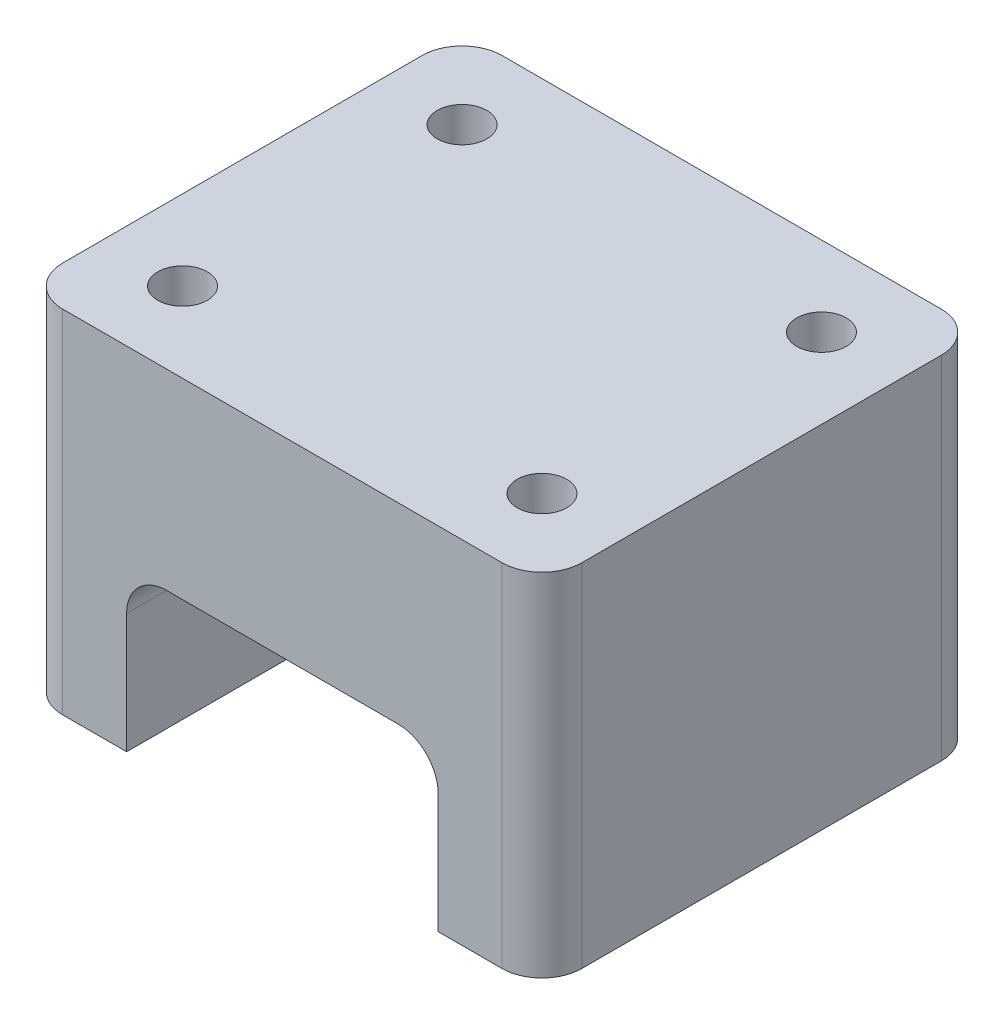
ISO-10303-21;
HEADER;
FILE_DESCRIPTION(('STEP AP214'),'2;1');
FILE_NAME('part.step','',(''),(''),'','','');
FILE_SCHEMA(('AUTOMOTIVE_DESIGN { 1 0 10303 214 1 1 1 1 }'));
ENDSEC;
DATA;
#1=APPLICATION_CONTEXT('core data for automotive mechanical design processes');
#2=APPLICATION_PROTOCOL_DEFINITION('international standard','automotive_design',2000,#1);
#3=PRODUCT_CONTEXT('',#1,'mechanical');
#4=PRODUCT('Part','Part','',(#3));
#5=PRODUCT_RELATED_PRODUCT_CATEGORY('part','',(#4));
#6=PRODUCT_DEFINITION_FORMATION('','',#4);
#7=PRODUCT_DEFINITION_CONTEXT('part definition',#1,'design');
#8=PRODUCT_DEFINITION('design','',#6,#7);
#9=PRODUCT_DEFINITION_SHAPE('','',#8);
#10=(LENGTH_UNIT() NAMED_UNIT(*) SI_UNIT(.MILLI.,.METRE.));
#11=(NAMED_UNIT(*) PLANE_ANGLE_UNIT() SI_UNIT($,.RADIAN.));
#12=(NAMED_UNIT(*) SI_UNIT($,.STERADIAN.) SOLID_ANGLE_UNIT());
#13=UNCERTAINTY_MEASURE_WITH_UNIT(LENGTH_MEASURE(1.E-05),#10,'distance_accuracy_value','');
#14=(GEOMETRIC_REPRESENTATION_CONTEXT(3) GLOBAL_UNCERTAINTY_ASSIGNED_CONTEXT((#13)) GLOBAL_UNIT_ASSIGNED_CONTEXT((#10,
#11,#12)) REPRESENTATION_CONTEXT('',''));
#15=CARTESIAN_POINT('',(0.,0.,0.));
#16=DIRECTION('',(0.,0.,1.));
#17=DIRECTION('',(1.,0.,0.));
#18=AXIS2_PLACEMENT_3D('',#15,#16,#17);
#19=CARTESIAN_POINT('',(0.,0.,0.));
#20=DIRECTION('',(0.,-1.,0.));
#21=DIRECTION('',(0.,0.,-1.));
#22=AXIS2_PLACEMENT_3D('',#19,#20,#21);
#23=PLANE('',#22);
#24=CARTESIAN_POINT('',(58.5,0.,-48.500000000001));
#25=DIRECTION('',(0.,-1.,0.));
#26=DIRECTION('',(0.,0.,-1.));
#27=AXIS2_PLACEMENT_3D('',#24,#25,#26);
#28=CIRCLE('',#27,3.09999999999999);
#29=CARTESIAN_POINT('',(58.5,0.,-51.600000000001));
#30=VERTEX_POINT('',#29);
#31=EDGE_CURVE('E313',#30,#30,#28,.T.);
#32=ORIENTED_EDGE('',*,*,#31,.F.);
#33=EDGE_LOOP('',(#32));
#34=FACE_BOUND('',#33,.T.);
#35=CARTESIAN_POINT('',(58.5,0.,-6.50000000000274));
#36=DIRECTION('',(0.,-1.,0.));
#37=DIRECTION('',(0.,0.,-1.));
#38=AXIS2_PLACEMENT_3D('',#35,#36,#37);
#39=CIRCLE('',#38,3.1);
#40=CARTESIAN_POINT('',(58.5,0.,-9.60000000000274));
#41=VERTEX_POINT('',#40);
#42=EDGE_CURVE('E324',#41,#41,#39,.T.);
#43=ORIENTED_EDGE('',*,*,#42,.F.);
#44=EDGE_LOOP('',(#43));
#45=FACE_BOUND('',#44,.T.);
#46=DIRECTION('',(0.,0.,-1.));
#47=VECTOR('',#46,1.);
#48=CARTESIAN_POINT('',(65.,0.,0.));
#49=LINE('',#48,#47);
#50=CARTESIAN_POINT('',(65.,0.,-5.));
#51=VERTEX_POINT('',#50);
#52=CARTESIAN_POINT('',(65.,0.,-50.));
#53=VERTEX_POINT('',#52);
#54=EDGE_CURVE('E159',#51,#53,#49,.T.);
#55=ORIENTED_EDGE('',*,*,#54,.F.);
#56=CARTESIAN_POINT('',(60.,0.,-5.));
#57=DIRECTION('',(0.,-1.,0.));
#58=DIRECTION('',(0.,0.,-1.));
#59=AXIS2_PLACEMENT_3D('',#56,#57,#58);
#60=CIRCLE('',#59,5.);
#61=CARTESIAN_POINT('',(60.,0.,0.));
#62=VERTEX_POINT('',#61);
#63=EDGE_CURVE('E191',#51,#62,#60,.T.);
#64=ORIENTED_EDGE('',*,*,#63,.T.);
#65=DIRECTION('',(1.,0.,0.));
#66=VECTOR('',#65,1.);
#67=CARTESIAN_POINT('',(0.,0.,0.));
#68=LINE('',#67,#66);
#69=CARTESIAN_POINT('',(52.,0.,0.));
#70=VERTEX_POINT('',#69);
#71=EDGE_CURVE('E226',#70,#62,#68,.T.);
#72=ORIENTED_EDGE('',*,*,#71,.F.);
#73=DIRECTION('',(0.,0.,1.));
#74=VECTOR('',#73,1.);
#75=CARTESIAN_POINT('',(52.,0.,-55.));
#76=LINE('',#75,#74);
#77=CARTESIAN_POINT('',(52.,0.,-55.));
#78=VERTEX_POINT('',#77);
#79=EDGE_CURVE('E155',#78,#70,#76,.T.);
#80=ORIENTED_EDGE('',*,*,#79,.F.);
#81=DIRECTION('',(-1.,0.,0.));
#82=VECTOR('',#81,1.);
#83=CARTESIAN_POINT('',(0.,0.,-55.));
#84=LINE('',#83,#82);
#85=CARTESIAN_POINT('',(60.,0.,-55.));
#86=VERTEX_POINT('',#85);
#87=EDGE_CURVE('E158',#86,#78,#84,.T.);
#88=ORIENTED_EDGE('',*,*,#87,.F.);
#89=CARTESIAN_POINT('',(60.,0.,-50.));
#90=DIRECTION('',(0.,-1.,0.));
#91=DIRECTION('',(0.,0.,-1.));
#92=AXIS2_PLACEMENT_3D('',#89,#90,#91);
#93=CIRCLE('',#92,5.);
#94=EDGE_CURVE('E189',#86,#53,#93,.T.);
#95=ORIENTED_EDGE('',*,*,#94,.T.);
#96=EDGE_LOOP('',(#55,#64,#72,#80,#88,#95));
#97=FACE_BOUND('',#96,.T.);
#98=ADVANCED_FACE('F37',(#34,#45,#97),#23,.T.);
#99=CARTESIAN_POINT('',(0.,44.,0.));
#100=DIRECTION('',(1.,0.,0.));
#101=DIRECTION('',(0.,0.,-1.));
#102=AXIS2_PLACEMENT_3D('',#99,#100,#101);
#103=PLANE('',#102);
#104=DIRECTION('',(0.,0.,1.));
#105=VECTOR('',#104,1.);
#106=CARTESIAN_POINT('',(0.,0.,0.));
#107=LINE('',#106,#105);
#108=CARTESIAN_POINT('',(0.,0.,-50.));
#109=VERTEX_POINT('',#108);
#110=CARTESIAN_POINT('',(0.,0.,-5.));
#111=VERTEX_POINT('',#110);
#112=EDGE_CURVE('E230',#109,#111,#107,.T.);
#113=ORIENTED_EDGE('',*,*,#112,.T.);
#114=DIRECTION('',(0.,-1.,0.));
#115=VECTOR('',#114,1.);
#116=CARTESIAN_POINT('',(0.,44.,-5.));
#117=LINE('',#116,#115);
#118=CARTESIAN_POINT('',(0.,44.,-5.));
#119=VERTEX_POINT('',#118);
#120=EDGE_CURVE('E211',#111,#119,#117,.F.);
#121=ORIENTED_EDGE('',*,*,#120,.T.);
#122=DIRECTION('',(0.,0.,1.));
#123=VECTOR('',#122,1.);
#124=CARTESIAN_POINT('',(0.,44.,0.));
#125=LINE('',#124,#123);
#126=CARTESIAN_POINT('',(0.,44.,-50.));
#127=VERTEX_POINT('',#126);
#128=EDGE_CURVE('E161',#127,#119,#125,.T.);
#129=ORIENTED_EDGE('',*,*,#128,.F.);
#130=DIRECTION('',(0.,-1.,0.));
#131=VECTOR('',#130,1.);
#132=CARTESIAN_POINT('',(0.,44.,-50.));
#133=LINE('',#132,#131);
#134=EDGE_CURVE('E208',#127,#109,#133,.T.);
#135=ORIENTED_EDGE('',*,*,#134,.T.);
#136=EDGE_LOOP('',(#113,#121,#129,#135));
#137=FACE_BOUND('',#136,.T.);
#138=ADVANCED_FACE('F265',(#137),#103,.F.);
#139=CARTESIAN_POINT('',(0.,44.,0.));
#140=DIRECTION('',(0.,0.,-1.));
#141=DIRECTION('',(-1.,0.,0.));
#142=AXIS2_PLACEMENT_3D('',#139,#140,#141);
#143=PLANE('',#142);
#144=ORIENTED_EDGE('',*,*,#71,.T.);
#145=DIRECTION('',(0.,-1.,0.));
#146=VECTOR('',#145,1.);
#147=CARTESIAN_POINT('',(60.,44.,0.));
#148=LINE('',#147,#146);
#149=CARTESIAN_POINT('',(60.,44.,0.));
#150=VERTEX_POINT('',#149);
#151=EDGE_CURVE('E196',#62,#150,#148,.F.);
#152=ORIENTED_EDGE('',*,*,#151,.T.);
#153=DIRECTION('',(1.,0.,0.));
#154=VECTOR('',#153,1.);
#155=CARTESIAN_POINT('',(0.,44.,0.));
#156=LINE('',#155,#154);
#157=CARTESIAN_POINT('',(5.,44.,0.));
#158=VERTEX_POINT('',#157);
#159=EDGE_CURVE('E238',#158,#150,#156,.T.);
#160=ORIENTED_EDGE('',*,*,#159,.F.);
#161=DIRECTION('',(0.,-1.,0.));
#162=VECTOR('',#161,1.);
#163=CARTESIAN_POINT('',(5.,44.,0.));
#164=LINE('',#163,#162);
#165=CARTESIAN_POINT('',(5.,0.,0.));
#166=VERTEX_POINT('',#165);
#167=EDGE_CURVE('E193',#158,#166,#164,.T.);
#168=ORIENTED_EDGE('',*,*,#167,.T.);
#169=CARTESIAN_POINT('',(13.,0.,0.));
#170=VERTEX_POINT('',#169);
#171=EDGE_CURVE('E163',#166,#170,#68,.T.);
#172=ORIENTED_EDGE('',*,*,#171,.T.);
#173=DIRECTION('',(0.,-1.,0.));
#174=VECTOR('',#173,1.);
#175=CARTESIAN_POINT('',(13.,0.,0.));
#176=LINE('',#175,#174);
#177=CARTESIAN_POINT('',(13.,15.,0.));
#178=VERTEX_POINT('',#177);
#179=EDGE_CURVE('E154',#178,#170,#176,.T.);
#180=ORIENTED_EDGE('',*,*,#179,.F.);
#181=CARTESIAN_POINT('',(18.,15.,0.));
#182=DIRECTION('',(0.,0.,-1.));
#183=DIRECTION('',(-1.,0.,0.));
#184=AXIS2_PLACEMENT_3D('',#181,#182,#183);
#185=CIRCLE('',#184,5.);
#186=CARTESIAN_POINT('',(18.,20.,0.));
#187=VERTEX_POINT('',#186);
#188=EDGE_CURVE('E177',#178,#187,#185,.T.);
#189=ORIENTED_EDGE('',*,*,#188,.T.);
#190=DIRECTION('',(-1.,0.,0.));
#191=VECTOR('',#190,1.);
#192=CARTESIAN_POINT('',(52.,20.,0.));
#193=LINE('',#192,#191);
#194=CARTESIAN_POINT('',(47.,20.,0.));
#195=VERTEX_POINT('',#194);
#196=EDGE_CURVE('E331',#195,#187,#193,.T.);
#197=ORIENTED_EDGE('',*,*,#196,.F.);
#198=CARTESIAN_POINT('',(47.,15.,0.));
#199=DIRECTION('',(0.,0.,-1.));
#200=DIRECTION('',(-1.,0.,0.));
#201=AXIS2_PLACEMENT_3D('',#198,#199,#200);
#202=CIRCLE('',#201,5.);
#203=CARTESIAN_POINT('',(52.,15.,0.));
#204=VERTEX_POINT('',#203);
#205=EDGE_CURVE('E180',#195,#204,#202,.T.);
#206=ORIENTED_EDGE('',*,*,#205,.T.);
#207=DIRECTION('',(0.,1.,0.));
#208=VECTOR('',#207,1.);
#209=CARTESIAN_POINT('',(52.,0.,0.));
#210=LINE('',#209,#208);
#211=EDGE_CURVE('E248',#70,#204,#210,.T.);
#212=ORIENTED_EDGE('',*,*,#211,.F.);
#213=EDGE_LOOP('',(#144,#152,#160,#168,#172,#180,#189,#197,#206,#212));
#214=FACE_BOUND('',#213,.T.);
#215=ADVANCED_FACE('F246',(#214),#143,.F.);
#216=CARTESIAN_POINT('',(65.,44.,0.));
#217=DIRECTION('',(-1.,0.,0.));
#218=DIRECTION('',(0.,0.,1.));
#219=AXIS2_PLACEMENT_3D('',#216,#217,#218);
#220=PLANE('',#219);
#221=DIRECTION('',(0.,0.,-1.));
#222=VECTOR('',#221,1.);
#223=CARTESIAN_POINT('',(65.,44.,0.));
#224=LINE('',#223,#222);
#225=CARTESIAN_POINT('',(65.,44.,-5.));
#226=VERTEX_POINT('',#225);
#227=CARTESIAN_POINT('',(65.,44.,-50.));
#228=VERTEX_POINT('',#227);
#229=EDGE_CURVE('E241',#226,#228,#224,.T.);
#230=ORIENTED_EDGE('',*,*,#229,.F.);
#231=DIRECTION('',(0.,-1.,0.));
#232=VECTOR('',#231,1.);
#233=CARTESIAN_POINT('',(65.,44.,-5.));
#234=LINE('',#233,#232);
#235=EDGE_CURVE('E186',#226,#51,#234,.T.);
#236=ORIENTED_EDGE('',*,*,#235,.T.);
#237=ORIENTED_EDGE('',*,*,#54,.T.);
#238=DIRECTION('',(0.,-1.,0.));
#239=VECTOR('',#238,1.);
#240=CARTESIAN_POINT('',(65.,44.,-50.));
#241=LINE('',#240,#239);
#242=EDGE_CURVE('E184',#53,#228,#241,.F.);
#243=ORIENTED_EDGE('',*,*,#242,.T.);
#244=EDGE_LOOP('',(#230,#236,#237,#243));
#245=FACE_BOUND('',#244,.T.);
#246=ADVANCED_FACE('F257',(#245),#220,.F.);
#247=CARTESIAN_POINT('',(0.,44.,-55.));
#248=DIRECTION('',(0.,0.,1.));
#249=DIRECTION('',(1.,0.,0.));
#250=AXIS2_PLACEMENT_3D('',#247,#248,#249);
#251=PLANE('',#250);
#252=CARTESIAN_POINT('',(13.,0.,-55.));
#253=VERTEX_POINT('',#252);
#254=CARTESIAN_POINT('',(5.,0.,-55.));
#255=VERTEX_POINT('',#254);
#256=EDGE_CURVE('E139',#253,#255,#84,.T.);
#257=ORIENTED_EDGE('',*,*,#256,.T.);
#258=DIRECTION('',(0.,-1.,0.));
#259=VECTOR('',#258,1.);
#260=CARTESIAN_POINT('',(5.,44.,-55.));
#261=LINE('',#260,#259);
#262=CARTESIAN_POINT('',(5.,44.,-55.));
#263=VERTEX_POINT('',#262);
#264=EDGE_CURVE('E11',#255,#263,#261,.F.);
#265=ORIENTED_EDGE('',*,*,#264,.T.);
#266=DIRECTION('',(-1.,0.,0.));
#267=VECTOR('',#266,1.);
#268=CARTESIAN_POINT('',(0.,44.,-55.));
#269=LINE('',#268,#267);
#270=CARTESIAN_POINT('',(60.,44.,-55.));
#271=VERTEX_POINT('',#270);
#272=EDGE_CURVE('E170',#271,#263,#269,.T.);
#273=ORIENTED_EDGE('',*,*,#272,.F.);
#274=DIRECTION('',(0.,-1.,0.));
#275=VECTOR('',#274,1.);
#276=CARTESIAN_POINT('',(60.,44.,-55.));
#277=LINE('',#276,#275);
#278=EDGE_CURVE('E45',#271,#86,#277,.T.);
#279=ORIENTED_EDGE('',*,*,#278,.T.);
#280=ORIENTED_EDGE('',*,*,#87,.T.);
#281=DIRECTION('',(0.,1.,0.));
#282=VECTOR('',#281,1.);
#283=CARTESIAN_POINT('',(52.,0.,-55.));
#284=LINE('',#283,#282);
#285=CARTESIAN_POINT('',(52.,15.,-55.));
#286=VERTEX_POINT('',#285);
#287=EDGE_CURVE('E328',#78,#286,#284,.T.);
#288=ORIENTED_EDGE('',*,*,#287,.T.);
#289=CARTESIAN_POINT('',(47.,15.,-55.));
#290=DIRECTION('',(0.,0.,1.));
#291=DIRECTION('',(1.,0.,0.));
#292=AXIS2_PLACEMENT_3D('',#289,#290,#291);
#293=CIRCLE('',#292,5.);
#294=CARTESIAN_POINT('',(47.,20.,-55.));
#295=VERTEX_POINT('',#294);
#296=EDGE_CURVE('E182',#286,#295,#293,.T.);
#297=ORIENTED_EDGE('',*,*,#296,.T.);
#298=DIRECTION('',(-1.,0.,0.));
#299=VECTOR('',#298,1.);
#300=CARTESIAN_POINT('',(52.,20.,-55.));
#301=LINE('',#300,#299);
#302=CARTESIAN_POINT('',(18.,20.,-55.));
#303=VERTEX_POINT('',#302);
#304=EDGE_CURVE('E148',#295,#303,#301,.T.);
#305=ORIENTED_EDGE('',*,*,#304,.T.);
#306=CARTESIAN_POINT('',(18.,15.,-55.));
#307=DIRECTION('',(0.,0.,1.));
#308=DIRECTION('',(1.,0.,0.));
#309=AXIS2_PLACEMENT_3D('',#306,#307,#308);
#310=CIRCLE('',#309,5.);
#311=CARTESIAN_POINT('',(13.,15.,-55.));
#312=VERTEX_POINT('',#311);
#313=EDGE_CURVE('E143',#303,#312,#310,.T.);
#314=ORIENTED_EDGE('',*,*,#313,.T.);
#315=DIRECTION('',(0.,-1.,0.));
#316=VECTOR('',#315,1.);
#317=CARTESIAN_POINT('',(13.,0.,-55.));
#318=LINE('',#317,#316);
#319=EDGE_CURVE('E136',#312,#253,#318,.T.);
#320=ORIENTED_EDGE('',*,*,#319,.T.);
#321=EDGE_LOOP('',(#257,#265,#273,#279,#280,#288,#297,#305,#314,#320));
#322=FACE_BOUND('',#321,.T.);
#323=ADVANCED_FACE('F138',(#322),#251,.F.);
#324=CARTESIAN_POINT('',(0.,44.,0.));
#325=DIRECTION('',(0.,-1.,0.));
#326=DIRECTION('',(0.,0.,-1.));
#327=AXIS2_PLACEMENT_3D('',#324,#325,#326);
#328=PLANE('',#327);
#329=CARTESIAN_POINT('',(10.0000000000004,44.,-9.99999999999999));
#330=DIRECTION('',(0.,1.,0.));
#331=DIRECTION('',(0.,0.,1.));
#332=AXIS2_PLACEMENT_3D('',#329,#330,#331);
#333=CIRCLE('',#332,3.1);
#334=CARTESIAN_POINT('',(10.0000000000004,44.,-6.9));
#335=VERTEX_POINT('',#334);
#336=EDGE_CURVE('E626',#335,#335,#333,.T.);
#337=ORIENTED_EDGE('',*,*,#336,.F.);
#338=EDGE_LOOP('',(#337));
#339=FACE_BOUND('',#338,.T.);
#340=CARTESIAN_POINT('',(55.0000000000004,44.,-9.99999999999999));
#341=DIRECTION('',(0.,1.,0.));
#342=DIRECTION('',(0.,0.,1.));
#343=AXIS2_PLACEMENT_3D('',#340,#341,#342);
#344=CIRCLE('',#343,3.1);
#345=CARTESIAN_POINT('',(55.0000000000004,44.,-6.89999999999999));
#346=VERTEX_POINT('',#345);
#347=EDGE_CURVE('E625',#346,#346,#344,.T.);
#348=ORIENTED_EDGE('',*,*,#347,.F.);
#349=EDGE_LOOP('',(#348));
#350=FACE_BOUND('',#349,.T.);
#351=CARTESIAN_POINT('',(55.,44.,-45.));
#352=DIRECTION('',(0.,1.,0.));
#353=DIRECTION('',(0.,0.,1.));
#354=AXIS2_PLACEMENT_3D('',#351,#352,#353);
#355=CIRCLE('',#354,3.09999999999999);
#356=CARTESIAN_POINT('',(55.,44.,-41.9));
#357=VERTEX_POINT('',#356);
#358=EDGE_CURVE('E648',#357,#357,#355,.T.);
#359=ORIENTED_EDGE('',*,*,#358,.F.);
#360=EDGE_LOOP('',(#359));
#361=FACE_BOUND('',#360,.T.);
#362=CARTESIAN_POINT('',(10.,44.,-45.));
#363=DIRECTION('',(0.,1.,0.));
#364=DIRECTION('',(0.,0.,1.));
#365=AXIS2_PLACEMENT_3D('',#362,#363,#364);
#366=CIRCLE('',#365,3.1);
#367=CARTESIAN_POINT('',(10.,44.,-41.9));
#368=VERTEX_POINT('',#367);
#369=EDGE_CURVE('E637',#368,#368,#366,.T.);
#370=ORIENTED_EDGE('',*,*,#369,.F.);
#371=EDGE_LOOP('',(#370));
#372=FACE_BOUND('',#371,.T.);
#373=ORIENTED_EDGE('',*,*,#159,.T.);
#374=CARTESIAN_POINT('',(60.,44.,-5.));
#375=DIRECTION('',(0.,-1.,0.));
#376=DIRECTION('',(0.,0.,-1.));
#377=AXIS2_PLACEMENT_3D('',#374,#375,#376);
#378=CIRCLE('',#377,5.);
#379=EDGE_CURVE('E204',#150,#226,#378,.F.);
#380=ORIENTED_EDGE('',*,*,#379,.T.);
#381=ORIENTED_EDGE('',*,*,#229,.T.);
#382=CARTESIAN_POINT('',(60.,44.,-50.));
#383=DIRECTION('',(0.,-1.,0.));
#384=DIRECTION('',(0.,0.,-1.));
#385=AXIS2_PLACEMENT_3D('',#382,#383,#384);
#386=CIRCLE('',#385,5.);
#387=EDGE_CURVE('E198',#228,#271,#386,.F.);
#388=ORIENTED_EDGE('',*,*,#387,.T.);
#389=ORIENTED_EDGE('',*,*,#272,.T.);
#390=CARTESIAN_POINT('',(5.,44.,-50.));
#391=DIRECTION('',(0.,-1.,0.));
#392=DIRECTION('',(0.,0.,-1.));
#393=AXIS2_PLACEMENT_3D('',#390,#391,#392);
#394=CIRCLE('',#393,5.);
#395=EDGE_CURVE('E200',#263,#127,#394,.F.);
#396=ORIENTED_EDGE('',*,*,#395,.T.);
#397=ORIENTED_EDGE('',*,*,#128,.T.);
#398=CARTESIAN_POINT('',(5.,44.,-5.));
#399=DIRECTION('',(0.,-1.,0.));
#400=DIRECTION('',(0.,0.,-1.));
#401=AXIS2_PLACEMENT_3D('',#398,#399,#400);
#402=CIRCLE('',#401,5.);
#403=EDGE_CURVE('E202',#119,#158,#402,.F.);
#404=ORIENTED_EDGE('',*,*,#403,.T.);
#405=EDGE_LOOP('',(#373,#380,#381,#388,#389,#396,#397,#404));
#406=FACE_BOUND('',#405,.T.);
#407=ADVANCED_FACE('F255',(#339,#350,#361,#372,#406),#328,.F.);
#408=CARTESIAN_POINT('',(6.49999999999998,0.,-6.50000000000274));
#409=DIRECTION('',(0.,-1.,0.));
#410=DIRECTION('',(0.,0.,-1.));
#411=AXIS2_PLACEMENT_3D('',#408,#409,#410);
#412=CIRCLE('',#411,3.1);
#413=CARTESIAN_POINT('',(6.49999999999998,0.,-9.60000000000274));
#414=VERTEX_POINT('',#413);
#415=EDGE_CURVE('E304',#414,#414,#412,.T.);
#416=ORIENTED_EDGE('',*,*,#415,.F.);
#417=EDGE_LOOP('',(#416));
#418=FACE_BOUND('',#417,.T.);
#419=CARTESIAN_POINT('',(6.49999999999998,0.,-48.500000000001));
#420=DIRECTION('',(0.,-1.,0.));
#421=DIRECTION('',(0.,0.,-1.));
#422=AXIS2_PLACEMENT_3D('',#419,#420,#421);
#423=CIRCLE('',#422,3.1);
#424=CARTESIAN_POINT('',(6.49999999999998,0.,-51.600000000001));
#425=VERTEX_POINT('',#424);
#426=EDGE_CURVE('E307',#425,#425,#423,.T.);
#427=ORIENTED_EDGE('',*,*,#426,.F.);
#428=EDGE_LOOP('',(#427));
#429=FACE_BOUND('',#428,.T.);
#430=ORIENTED_EDGE('',*,*,#171,.F.);
#431=CARTESIAN_POINT('',(5.,0.,-5.));
#432=DIRECTION('',(0.,-1.,0.));
#433=DIRECTION('',(0.,0.,-1.));
#434=AXIS2_PLACEMENT_3D('',#431,#432,#433);
#435=CIRCLE('',#434,5.);
#436=EDGE_CURVE('E58',#166,#111,#435,.T.);
#437=ORIENTED_EDGE('',*,*,#436,.T.);
#438=ORIENTED_EDGE('',*,*,#112,.F.);
#439=CARTESIAN_POINT('',(5.,0.,-50.));
#440=DIRECTION('',(0.,-1.,0.));
#441=DIRECTION('',(0.,0.,-1.));
#442=AXIS2_PLACEMENT_3D('',#439,#440,#441);
#443=CIRCLE('',#442,5.);
#444=EDGE_CURVE('E52',#109,#255,#443,.T.);
#445=ORIENTED_EDGE('',*,*,#444,.T.);
#446=ORIENTED_EDGE('',*,*,#256,.F.);
#447=DIRECTION('',(0.,0.,1.));
#448=VECTOR('',#447,1.);
#449=CARTESIAN_POINT('',(13.,0.,-55.));
#450=LINE('',#449,#448);
#451=EDGE_CURVE('E147',#253,#170,#450,.T.);
#452=ORIENTED_EDGE('',*,*,#451,.T.);
#453=EDGE_LOOP('',(#430,#437,#438,#445,#446,#452));
#454=FACE_BOUND('',#453,.T.);
#455=ADVANCED_FACE('F157',(#418,#429,#454),#23,.T.);
#456=CARTESIAN_POINT('',(52.,0.,-55.));
#457=DIRECTION('',(1.,0.,0.));
#458=DIRECTION('',(0.,0.,-1.));
#459=AXIS2_PLACEMENT_3D('',#456,#457,#458);
#460=PLANE('',#459);
#461=ORIENTED_EDGE('',*,*,#211,.T.);
#462=DIRECTION('',(0.,0.,1.));
#463=VECTOR('',#462,1.);
#464=CARTESIAN_POINT('',(52.,15.,-55.));
#465=LINE('',#464,#463);
#466=EDGE_CURVE('E175',#204,#286,#465,.F.);
#467=ORIENTED_EDGE('',*,*,#466,.T.);
#468=ORIENTED_EDGE('',*,*,#287,.F.);
#469=ORIENTED_EDGE('',*,*,#79,.T.);
#470=EDGE_LOOP('',(#461,#467,#468,#469));
#471=FACE_BOUND('',#470,.T.);
#472=ADVANCED_FACE('F292',(#471),#460,.F.);
#473=CARTESIAN_POINT('',(13.,0.,-55.));
#474=DIRECTION('',(-1.,0.,0.));
#475=DIRECTION('',(0.,0.,1.));
#476=AXIS2_PLACEMENT_3D('',#473,#474,#475);
#477=PLANE('',#476);
#478=ORIENTED_EDGE('',*,*,#319,.F.);
#479=DIRECTION('',(0.,0.,1.));
#480=VECTOR('',#479,1.);
#481=CARTESIAN_POINT('',(13.,15.,0.));
#482=LINE('',#481,#480);
#483=EDGE_CURVE('E167',#312,#178,#482,.T.);
#484=ORIENTED_EDGE('',*,*,#483,.T.);
#485=ORIENTED_EDGE('',*,*,#179,.T.);
#486=ORIENTED_EDGE('',*,*,#451,.F.);
#487=EDGE_LOOP('',(#478,#484,#485,#486));
#488=FACE_BOUND('',#487,.T.);
#489=ADVANCED_FACE('F152',(#488),#477,.F.);
#490=CARTESIAN_POINT('',(52.,20.,-55.));
#491=DIRECTION('',(0.,1.,0.));
#492=DIRECTION('',(-1.,0.,0.));
#493=AXIS2_PLACEMENT_3D('',#490,#491,#492);
#494=PLANE('',#493);
#495=ORIENTED_EDGE('',*,*,#196,.T.);
#496=DIRECTION('',(0.,0.,1.));
#497=VECTOR('',#496,1.);
#498=CARTESIAN_POINT('',(18.,20.,-55.));
#499=LINE('',#498,#497);
#500=EDGE_CURVE('E173',#187,#303,#499,.F.);
#501=ORIENTED_EDGE('',*,*,#500,.T.);
#502=ORIENTED_EDGE('',*,*,#304,.F.);
#503=DIRECTION('',(0.,0.,1.));
#504=VECTOR('',#503,1.);
#505=CARTESIAN_POINT('',(47.,20.,0.));
#506=LINE('',#505,#504);
#507=EDGE_CURVE('E169',#295,#195,#506,.T.);
#508=ORIENTED_EDGE('',*,*,#507,.T.);
#509=EDGE_LOOP('',(#495,#501,#502,#508));
#510=FACE_BOUND('',#509,.T.);
#511=ADVANCED_FACE('F336',(#510),#494,.F.);
#512=CARTESIAN_POINT('',(18.,15.,-55.));
#513=DIRECTION('',(0.,0.,-1.));
#514=DIRECTION('',(-1.,0.,0.));
#515=AXIS2_PLACEMENT_3D('',#512,#513,#514);
#516=CYLINDRICAL_SURFACE('',#515,5.);
#517=ORIENTED_EDGE('',*,*,#313,.F.);
#518=ORIENTED_EDGE('',*,*,#500,.F.);
#519=ORIENTED_EDGE('',*,*,#188,.F.);
#520=ORIENTED_EDGE('',*,*,#483,.F.);
#521=EDGE_LOOP('',(#517,#518,#519,#520));
#522=FACE_BOUND('',#521,.T.);
#523=ADVANCED_FACE('F340',(#522),#516,.F.);
#524=CARTESIAN_POINT('',(47.,15.,-55.));
#525=DIRECTION('',(0.,0.,-1.));
#526=DIRECTION('',(-1.,0.,0.));
#527=AXIS2_PLACEMENT_3D('',#524,#525,#526);
#528=CYLINDRICAL_SURFACE('',#527,5.);
#529=ORIENTED_EDGE('',*,*,#296,.F.);
#530=ORIENTED_EDGE('',*,*,#466,.F.);
#531=ORIENTED_EDGE('',*,*,#205,.F.);
#532=ORIENTED_EDGE('',*,*,#507,.F.);
#533=EDGE_LOOP('',(#529,#530,#531,#532));
#534=FACE_BOUND('',#533,.T.);
#535=ADVANCED_FACE('F342',(#534),#528,.F.);
#536=CARTESIAN_POINT('',(6.49999999999998,8.5,-48.500000000001));
#537=DIRECTION('',(0.,-1.,0.));
#538=DIRECTION('',(0.,0.,-1.));
#539=AXIS2_PLACEMENT_3D('',#536,#537,#538);
#540=CYLINDRICAL_SURFACE('',#539,3.1);
#541=CARTESIAN_POINT('',(6.49999999999998,8.5,-48.500000000001));
#542=DIRECTION('',(0.,-1.,0.));
#543=DIRECTION('',(0.,0.,-1.));
#544=AXIS2_PLACEMENT_3D('',#541,#542,#543);
#545=CIRCLE('',#544,3.1);
#546=CARTESIAN_POINT('',(6.49999999999998,8.5,-51.600000000001));
#547=VERTEX_POINT('',#546);
#548=EDGE_CURVE('E309',#547,#547,#545,.T.);
#549=ORIENTED_EDGE('',*,*,#548,.F.);
#550=EDGE_LOOP('',(#549));
#551=FACE_BOUND('',#550,.T.);
#552=ORIENTED_EDGE('',*,*,#426,.T.);
#553=EDGE_LOOP('',(#552));
#554=FACE_BOUND('',#553,.T.);
#555=ADVANCED_FACE('F348',(#551,#554),#540,.F.);
#556=CARTESIAN_POINT('',(6.49999999999998,8.5,-48.500000000001));
#557=DIRECTION('',(0.,-1.,0.));
#558=DIRECTION('',(0.,0.,-1.));
#559=AXIS2_PLACEMENT_3D('',#556,#557,#558);
#560=PLANE('',#559);
#561=ORIENTED_EDGE('',*,*,#548,.T.);
#562=EDGE_LOOP('',(#561));
#563=FACE_BOUND('',#562,.T.);
#564=ADVANCED_FACE('F408',(#563),#560,.T.);
#565=CARTESIAN_POINT('',(6.49999999999998,8.5,-6.50000000000274));
#566=DIRECTION('',(0.,-1.,0.));
#567=DIRECTION('',(0.,0.,-1.));
#568=AXIS2_PLACEMENT_3D('',#565,#566,#567);
#569=CYLINDRICAL_SURFACE('',#568,3.1);
#570=CARTESIAN_POINT('',(6.49999999999998,8.5,-6.50000000000274));
#571=DIRECTION('',(0.,-1.,0.));
#572=DIRECTION('',(0.,0.,-1.));
#573=AXIS2_PLACEMENT_3D('',#570,#571,#572);
#574=CIRCLE('',#573,3.1);
#575=CARTESIAN_POINT('',(6.49999999999998,8.5,-9.60000000000274));
#576=VERTEX_POINT('',#575);
#577=EDGE_CURVE('E310',#576,#576,#574,.T.);
#578=ORIENTED_EDGE('',*,*,#577,.F.);
#579=EDGE_LOOP('',(#578));
#580=FACE_BOUND('',#579,.T.);
#581=ORIENTED_EDGE('',*,*,#415,.T.);
#582=EDGE_LOOP('',(#581));
#583=FACE_BOUND('',#582,.T.);
#584=ADVANCED_FACE('F419',(#580,#583),#569,.F.);
#585=CARTESIAN_POINT('',(6.49999999999998,8.5,-6.50000000000274));
#586=DIRECTION('',(0.,-1.,0.));
#587=DIRECTION('',(0.,0.,-1.));
#588=AXIS2_PLACEMENT_3D('',#585,#586,#587);
#589=PLANE('',#588);
#590=ORIENTED_EDGE('',*,*,#577,.T.);
#591=EDGE_LOOP('',(#590));
#592=FACE_BOUND('',#591,.T.);
#593=ADVANCED_FACE('F430',(#592),#589,.T.);
#594=CARTESIAN_POINT('',(58.5,8.5,-6.50000000000274));
#595=DIRECTION('',(0.,-1.,0.));
#596=DIRECTION('',(0.,0.,-1.));
#597=AXIS2_PLACEMENT_3D('',#594,#595,#596);
#598=CYLINDRICAL_SURFACE('',#597,3.1);
#599=CARTESIAN_POINT('',(58.5,8.5,-6.50000000000274));
#600=DIRECTION('',(0.,-1.,0.));
#601=DIRECTION('',(0.,0.,-1.));
#602=AXIS2_PLACEMENT_3D('',#599,#600,#601);
#603=CIRCLE('',#602,3.1);
#604=CARTESIAN_POINT('',(58.5,8.5,-9.60000000000274));
#605=VERTEX_POINT('',#604);
#606=EDGE_CURVE('E321',#605,#605,#603,.T.);
#607=ORIENTED_EDGE('',*,*,#606,.F.);
#608=EDGE_LOOP('',(#607));
#609=FACE_BOUND('',#608,.T.);
#610=ORIENTED_EDGE('',*,*,#42,.T.);
#611=EDGE_LOOP('',(#610));
#612=FACE_BOUND('',#611,.T.);
#613=ADVANCED_FACE('F441',(#609,#612),#598,.F.);
#614=CARTESIAN_POINT('',(58.5,8.5,-6.50000000000274));
#615=DIRECTION('',(0.,-1.,0.));
#616=DIRECTION('',(0.,0.,-1.));
#617=AXIS2_PLACEMENT_3D('',#614,#615,#616);
#618=PLANE('',#617);
#619=ORIENTED_EDGE('',*,*,#606,.T.);
#620=EDGE_LOOP('',(#619));
#621=FACE_BOUND('',#620,.T.);
#622=ADVANCED_FACE('F452',(#621),#618,.T.);
#623=CARTESIAN_POINT('',(58.5,8.5,-48.500000000001));
#624=DIRECTION('',(0.,-1.,0.));
#625=DIRECTION('',(0.,0.,-1.));
#626=AXIS2_PLACEMENT_3D('',#623,#624,#625);
#627=CYLINDRICAL_SURFACE('',#626,3.09999999999999);
#628=CARTESIAN_POINT('',(58.5,8.5,-48.500000000001));
#629=DIRECTION('',(0.,-1.,0.));
#630=DIRECTION('',(0.,0.,-1.));
#631=AXIS2_PLACEMENT_3D('',#628,#629,#630);
#632=CIRCLE('',#631,3.09999999999999);
#633=CARTESIAN_POINT('',(58.5,8.5,-51.600000000001));
#634=VERTEX_POINT('',#633);
#635=EDGE_CURVE('E327',#634,#634,#632,.T.);
#636=ORIENTED_EDGE('',*,*,#635,.F.);
#637=EDGE_LOOP('',(#636));
#638=FACE_BOUND('',#637,.T.);
#639=ORIENTED_EDGE('',*,*,#31,.T.);
#640=EDGE_LOOP('',(#639));
#641=FACE_BOUND('',#640,.T.);
#642=ADVANCED_FACE('F463',(#638,#641),#627,.F.);
#643=CARTESIAN_POINT('',(58.5,8.5,-48.500000000001));
#644=DIRECTION('',(0.,-1.,0.));
#645=DIRECTION('',(0.,0.,-1.));
#646=AXIS2_PLACEMENT_3D('',#643,#644,#645);
#647=PLANE('',#646);
#648=ORIENTED_EDGE('',*,*,#635,.T.);
#649=EDGE_LOOP('',(#648));
#650=FACE_BOUND('',#649,.T.);
#651=ADVANCED_FACE('F474',(#650),#647,.T.);
#652=CARTESIAN_POINT('',(10.,34.,-45.));
#653=DIRECTION('',(0.,1.,0.));
#654=DIRECTION('',(0.,0.,1.));
#655=AXIS2_PLACEMENT_3D('',#652,#653,#654);
#656=CYLINDRICAL_SURFACE('',#655,3.1);
#657=CARTESIAN_POINT('',(10.,34.,-45.));
#658=DIRECTION('',(0.,1.,0.));
#659=DIRECTION('',(0.,0.,1.));
#660=AXIS2_PLACEMENT_3D('',#657,#658,#659);
#661=CIRCLE('',#660,3.1);
#662=CARTESIAN_POINT('',(10.,34.,-41.9));
#663=VERTEX_POINT('',#662);
#664=EDGE_CURVE('E320',#663,#663,#661,.T.);
#665=ORIENTED_EDGE('',*,*,#664,.F.);
#666=EDGE_LOOP('',(#665));
#667=FACE_BOUND('',#666,.T.);
#668=ORIENTED_EDGE('',*,*,#369,.T.);
#669=EDGE_LOOP('',(#668));
#670=FACE_BOUND('',#669,.T.);
#671=ADVANCED_FACE('F485',(#667,#670),#656,.F.);
#672=CARTESIAN_POINT('',(10.,34.,-45.));
#673=DIRECTION('',(0.,1.,0.));
#674=DIRECTION('',(0.,0.,1.));
#675=AXIS2_PLACEMENT_3D('',#672,#673,#674);
#676=PLANE('',#675);
#677=ORIENTED_EDGE('',*,*,#664,.T.);
#678=EDGE_LOOP('',(#677));
#679=FACE_BOUND('',#678,.T.);
#680=ADVANCED_FACE('F496',(#679),#676,.T.);
#681=CARTESIAN_POINT('',(55.,34.,-45.));
#682=DIRECTION('',(0.,1.,0.));
#683=DIRECTION('',(0.,0.,1.));
#684=AXIS2_PLACEMENT_3D('',#681,#682,#683);
#685=CYLINDRICAL_SURFACE('',#684,3.09999999999999);
#686=CARTESIAN_POINT('',(55.,34.,-45.));
#687=DIRECTION('',(0.,1.,0.));
#688=DIRECTION('',(0.,0.,1.));
#689=AXIS2_PLACEMENT_3D('',#686,#687,#688);
#690=CIRCLE('',#689,3.09999999999999);
#691=CARTESIAN_POINT('',(55.,34.,-41.9));
#692=VERTEX_POINT('',#691);
#693=EDGE_CURVE('E640',#692,#692,#690,.T.);
#694=ORIENTED_EDGE('',*,*,#693,.F.);
#695=EDGE_LOOP('',(#694));
#696=FACE_BOUND('',#695,.T.);
#697=ORIENTED_EDGE('',*,*,#358,.T.);
#698=EDGE_LOOP('',(#697));
#699=FACE_BOUND('',#698,.T.);
#700=ADVANCED_FACE('F507',(#696,#699),#685,.F.);
#701=CARTESIAN_POINT('',(55.,34.,-45.));
#702=DIRECTION('',(0.,1.,0.));
#703=DIRECTION('',(0.,0.,1.));
#704=AXIS2_PLACEMENT_3D('',#701,#702,#703);
#705=PLANE('',#704);
#706=ORIENTED_EDGE('',*,*,#693,.T.);
#707=EDGE_LOOP('',(#706));
#708=FACE_BOUND('',#707,.T.);
#709=ADVANCED_FACE('F518',(#708),#705,.T.);
#710=CARTESIAN_POINT('',(55.0000000000004,34.,-9.99999999999999));
#711=DIRECTION('',(0.,1.,0.));
#712=DIRECTION('',(0.,0.,1.));
#713=AXIS2_PLACEMENT_3D('',#710,#711,#712);
#714=CYLINDRICAL_SURFACE('',#713,3.1);
#715=CARTESIAN_POINT('',(55.0000000000004,34.,-9.99999999999999));
#716=DIRECTION('',(0.,1.,0.));
#717=DIRECTION('',(0.,0.,1.));
#718=AXIS2_PLACEMENT_3D('',#715,#716,#717);
#719=CIRCLE('',#718,3.1);
#720=CARTESIAN_POINT('',(55.0000000000004,34.,-6.89999999999999));
#721=VERTEX_POINT('',#720);
#722=EDGE_CURVE('E629',#721,#721,#719,.T.);
#723=ORIENTED_EDGE('',*,*,#722,.F.);
#724=EDGE_LOOP('',(#723));
#725=FACE_BOUND('',#724,.T.);
#726=ORIENTED_EDGE('',*,*,#347,.T.);
#727=EDGE_LOOP('',(#726));
#728=FACE_BOUND('',#727,.T.);
#729=ADVANCED_FACE('F529',(#725,#728),#714,.F.);
#730=CARTESIAN_POINT('',(55.0000000000004,34.,-9.99999999999999));
#731=DIRECTION('',(0.,1.,0.));
#732=DIRECTION('',(0.,0.,1.));
#733=AXIS2_PLACEMENT_3D('',#730,#731,#732);
#734=PLANE('',#733);
#735=ORIENTED_EDGE('',*,*,#722,.T.);
#736=EDGE_LOOP('',(#735));
#737=FACE_BOUND('',#736,.T.);
#738=ADVANCED_FACE('F540',(#737),#734,.T.);
#739=CARTESIAN_POINT('',(10.0000000000004,34.,-9.99999999999999));
#740=DIRECTION('',(0.,1.,0.));
#741=DIRECTION('',(0.,0.,1.));
#742=AXIS2_PLACEMENT_3D('',#739,#740,#741);
#743=CYLINDRICAL_SURFACE('',#742,3.1);
#744=CARTESIAN_POINT('',(10.0000000000004,34.,-9.99999999999999));
#745=DIRECTION('',(0.,1.,0.));
#746=DIRECTION('',(0.,0.,1.));
#747=AXIS2_PLACEMENT_3D('',#744,#745,#746);
#748=CIRCLE('',#747,3.1);
#749=CARTESIAN_POINT('',(10.0000000000004,34.,-6.9));
#750=VERTEX_POINT('',#749);
#751=EDGE_CURVE('E624',#750,#750,#748,.T.);
#752=ORIENTED_EDGE('',*,*,#751,.F.);
#753=EDGE_LOOP('',(#752));
#754=FACE_BOUND('',#753,.T.);
#755=ORIENTED_EDGE('',*,*,#336,.T.);
#756=EDGE_LOOP('',(#755));
#757=FACE_BOUND('',#756,.T.);
#758=ADVANCED_FACE('F551',(#754,#757),#743,.F.);
#759=CARTESIAN_POINT('',(10.0000000000004,34.,-9.99999999999999));
#760=DIRECTION('',(0.,1.,0.));
#761=DIRECTION('',(0.,0.,1.));
#762=AXIS2_PLACEMENT_3D('',#759,#760,#761);
#763=PLANE('',#762);
#764=ORIENTED_EDGE('',*,*,#751,.T.);
#765=EDGE_LOOP('',(#764));
#766=FACE_BOUND('',#765,.T.);
#767=ADVANCED_FACE('F277',(#766),#763,.T.);
#768=CARTESIAN_POINT('',(60.,44.,-5.));
#769=DIRECTION('',(0.,-1.,0.));
#770=DIRECTION('',(0.,0.,-1.));
#771=AXIS2_PLACEMENT_3D('',#768,#769,#770);
#772=CYLINDRICAL_SURFACE('',#771,5.);
#773=ORIENTED_EDGE('',*,*,#379,.F.);
#774=ORIENTED_EDGE('',*,*,#151,.F.);
#775=ORIENTED_EDGE('',*,*,#63,.F.);
#776=ORIENTED_EDGE('',*,*,#235,.F.);
#777=EDGE_LOOP('',(#773,#774,#775,#776));
#778=FACE_BOUND('',#777,.T.);
#779=ADVANCED_FACE('F251',(#778),#772,.T.);
#780=CARTESIAN_POINT('',(5.,44.,-5.));
#781=DIRECTION('',(0.,-1.,0.));
#782=DIRECTION('',(0.,0.,-1.));
#783=AXIS2_PLACEMENT_3D('',#780,#781,#782);
#784=CYLINDRICAL_SURFACE('',#783,5.);
#785=ORIENTED_EDGE('',*,*,#403,.F.);
#786=ORIENTED_EDGE('',*,*,#120,.F.);
#787=ORIENTED_EDGE('',*,*,#436,.F.);
#788=ORIENTED_EDGE('',*,*,#167,.F.);
#789=EDGE_LOOP('',(#785,#786,#787,#788));
#790=FACE_BOUND('',#789,.T.);
#791=ADVANCED_FACE('F270',(#790),#784,.T.);
#792=CARTESIAN_POINT('',(5.,44.,-50.));
#793=DIRECTION('',(0.,-1.,0.));
#794=DIRECTION('',(0.,0.,-1.));
#795=AXIS2_PLACEMENT_3D('',#792,#793,#794);
#796=CYLINDRICAL_SURFACE('',#795,5.);
#797=ORIENTED_EDGE('',*,*,#395,.F.);
#798=ORIENTED_EDGE('',*,*,#264,.F.);
#799=ORIENTED_EDGE('',*,*,#444,.F.);
#800=ORIENTED_EDGE('',*,*,#134,.F.);
#801=EDGE_LOOP('',(#797,#798,#799,#800));
#802=FACE_BOUND('',#801,.T.);
#803=ADVANCED_FACE('F263',(#802),#796,.T.);
#804=CARTESIAN_POINT('',(60.,44.,-50.));
#805=DIRECTION('',(0.,-1.,0.));
#806=DIRECTION('',(0.,0.,-1.));
#807=AXIS2_PLACEMENT_3D('',#804,#805,#806);
#808=CYLINDRICAL_SURFACE('',#807,5.);
#809=ORIENTED_EDGE('',*,*,#387,.F.);
#810=ORIENTED_EDGE('',*,*,#242,.F.);
#811=ORIENTED_EDGE('',*,*,#94,.F.);
#812=ORIENTED_EDGE('',*,*,#278,.F.);
#813=EDGE_LOOP('',(#809,#810,#811,#812));
#814=FACE_BOUND('',#813,.T.);
#815=ADVANCED_FACE('F39',(#814),#808,.T.);
#816=CLOSED_SHELL('',(#98,#138,#215,#246,#323,#407,#455,#472,#489,#511,#523,#535,#555,#564,#584,
#593,#613,#622,#642,#651,#671,#680,#700,#709,#729,#738,#758,#767,#779,#791,#803,#815));
#817=MANIFOLD_SOLID_BREP('B2',#816);
#818=ADVANCED_BREP_SHAPE_REPRESENTATION('',(#18,#817),#14);
#819=SHAPE_DEFINITION_REPRESENTATION(#9,#818);
ENDSEC;
END-ISO-10303-21;
